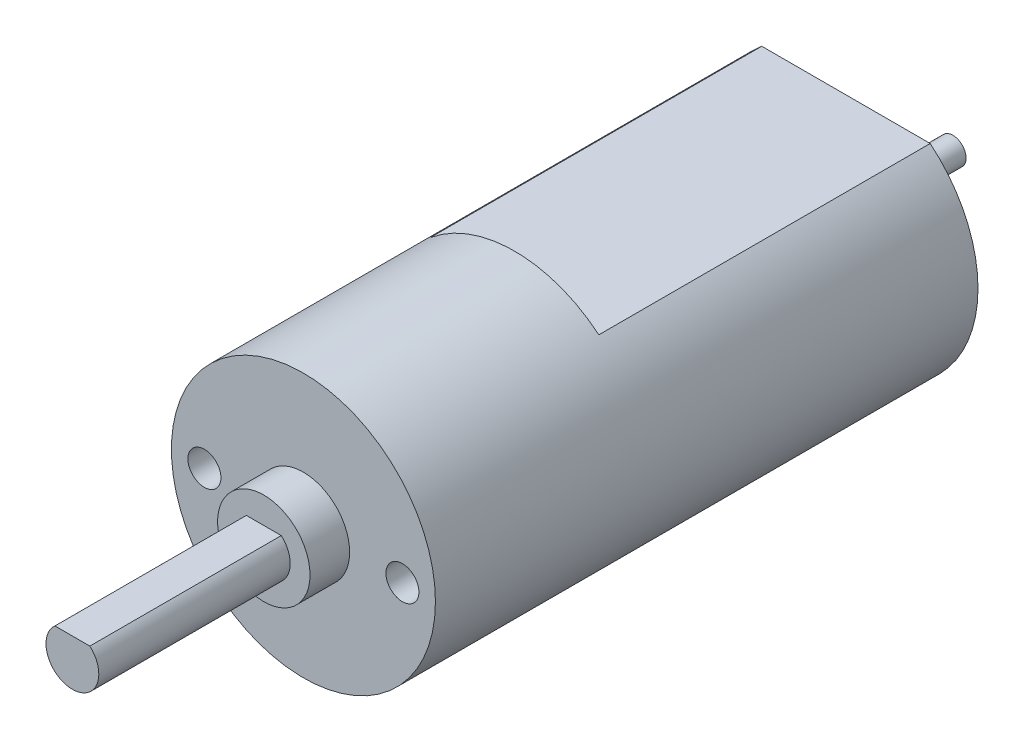
ISO-10303-21;
HEADER;
FILE_DESCRIPTION(('STEP AP214'),'2;1');
FILE_NAME('part.step','',(''),(''),'','','');
FILE_SCHEMA(('AUTOMOTIVE_DESIGN { 1 0 10303 214 1 1 1 1 }'));
ENDSEC;
DATA;
#1=APPLICATION_CONTEXT('core data for automotive mechanical design processes');
#2=APPLICATION_PROTOCOL_DEFINITION('international standard','automotive_design',2000,#1);
#3=PRODUCT_CONTEXT('',#1,'mechanical');
#4=PRODUCT('Part','Part','',(#3));
#5=PRODUCT_RELATED_PRODUCT_CATEGORY('part','',(#4));
#6=PRODUCT_DEFINITION_FORMATION('','',#4);
#7=PRODUCT_DEFINITION_CONTEXT('part definition',#1,'design');
#8=PRODUCT_DEFINITION('design','',#6,#7);
#9=PRODUCT_DEFINITION_SHAPE('','',#8);
#10=(LENGTH_UNIT() NAMED_UNIT(*) SI_UNIT(.MILLI.,.METRE.));
#11=(NAMED_UNIT(*) PLANE_ANGLE_UNIT() SI_UNIT($,.RADIAN.));
#12=(NAMED_UNIT(*) SI_UNIT($,.STERADIAN.) SOLID_ANGLE_UNIT());
#13=UNCERTAINTY_MEASURE_WITH_UNIT(LENGTH_MEASURE(1.E-05),#10,'distance_accuracy_value','');
#14=(GEOMETRIC_REPRESENTATION_CONTEXT(3) GLOBAL_UNCERTAINTY_ASSIGNED_CONTEXT((#13)) GLOBAL_UNIT_ASSIGNED_CONTEXT((#10,
#11,#12)) REPRESENTATION_CONTEXT('',''));
#15=CARTESIAN_POINT('',(0.,0.,0.));
#16=DIRECTION('',(0.,0.,1.));
#17=DIRECTION('',(1.,0.,0.));
#18=AXIS2_PLACEMENT_3D('',#15,#16,#17);
#19=CARTESIAN_POINT('',(0.,0.,-41.1));
#20=DIRECTION('',(0.,0.,1.));
#21=DIRECTION('',(1.,0.,0.));
#22=AXIS2_PLACEMENT_3D('',#19,#20,#21);
#23=CYLINDRICAL_SURFACE('',#22,10.);
#24=CARTESIAN_POINT('',(0.,0.,0.));
#25=DIRECTION('',(0.,0.,1.));
#26=DIRECTION('',(1.,0.,0.));
#27=AXIS2_PLACEMENT_3D('',#24,#25,#26);
#28=CIRCLE('',#27,10.);
#29=CARTESIAN_POINT('',(10.,0.,0.));
#30=VERTEX_POINT('',#29);
#31=EDGE_CURVE('E128',#30,#30,#28,.T.);
#32=ORIENTED_EDGE('',*,*,#31,.F.);
#33=EDGE_LOOP('',(#32));
#34=FACE_BOUND('',#33,.T.);
#35=DIRECTION('',(0.,0.,1.));
#36=VECTOR('',#35,1.);
#37=CARTESIAN_POINT('',(-6.38043885637971,-7.7,-41.1));
#38=LINE('',#37,#36);
#39=CARTESIAN_POINT('',(-6.38043885637971,-7.7,-41.1));
#40=VERTEX_POINT('',#39);
#41=CARTESIAN_POINT('',(-6.38043885637971,-7.7,-16.));
#42=VERTEX_POINT('',#41);
#43=EDGE_CURVE('E56',#40,#42,#38,.T.);
#44=ORIENTED_EDGE('',*,*,#43,.T.);
#45=CARTESIAN_POINT('',(0.,0.,-16.));
#46=DIRECTION('',(0.,0.,-1.));
#47=DIRECTION('',(0.,1.,0.));
#48=AXIS2_PLACEMENT_3D('',#45,#46,#47);
#49=CIRCLE('',#48,10.);
#50=CARTESIAN_POINT('',(6.38043885637971,-7.7,-16.));
#51=VERTEX_POINT('',#50);
#52=EDGE_CURVE('E106',#42,#51,#49,.F.);
#53=ORIENTED_EDGE('',*,*,#52,.T.);
#54=DIRECTION('',(0.,0.,1.));
#55=VECTOR('',#54,1.);
#56=CARTESIAN_POINT('',(6.38043885637971,-7.7,-41.1));
#57=LINE('',#56,#55);
#58=CARTESIAN_POINT('',(6.38043885637971,-7.7,-41.1));
#59=VERTEX_POINT('',#58);
#60=EDGE_CURVE('E117',#51,#59,#57,.F.);
#61=ORIENTED_EDGE('',*,*,#60,.T.);
#62=CARTESIAN_POINT('',(0.,0.,-41.1));
#63=DIRECTION('',(0.,0.,1.));
#64=DIRECTION('',(1.,0.,0.));
#65=AXIS2_PLACEMENT_3D('',#62,#63,#64);
#66=CIRCLE('',#65,10.);
#67=CARTESIAN_POINT('',(6.38043885637971,7.7,-41.1));
#68=VERTEX_POINT('',#67);
#69=EDGE_CURVE('E133',#59,#68,#66,.T.);
#70=ORIENTED_EDGE('',*,*,#69,.T.);
#71=DIRECTION('',(0.,0.,1.));
#72=VECTOR('',#71,1.);
#73=CARTESIAN_POINT('',(6.38043885637971,7.7,-41.1));
#74=LINE('',#73,#72);
#75=CARTESIAN_POINT('',(6.38043885637971,7.7,-16.));
#76=VERTEX_POINT('',#75);
#77=EDGE_CURVE('E125',#76,#68,#74,.F.);
#78=ORIENTED_EDGE('',*,*,#77,.F.);
#79=CARTESIAN_POINT('',(0.,0.,-16.));
#80=DIRECTION('',(0.,0.,1.));
#81=DIRECTION('',(0.,-1.,0.));
#82=AXIS2_PLACEMENT_3D('',#79,#80,#81);
#83=CIRCLE('',#82,10.);
#84=CARTESIAN_POINT('',(-6.38043885637971,7.7,-16.));
#85=VERTEX_POINT('',#84);
#86=EDGE_CURVE('E138',#85,#76,#83,.F.);
#87=ORIENTED_EDGE('',*,*,#86,.F.);
#88=DIRECTION('',(0.,0.,1.));
#89=VECTOR('',#88,1.);
#90=CARTESIAN_POINT('',(-6.38043885637971,7.7,-41.1));
#91=LINE('',#90,#89);
#92=CARTESIAN_POINT('',(-6.38043885637971,7.7,-41.1));
#93=VERTEX_POINT('',#92);
#94=EDGE_CURVE('E123',#93,#85,#91,.T.);
#95=ORIENTED_EDGE('',*,*,#94,.F.);
#96=EDGE_CURVE('E129',#93,#40,#66,.T.);
#97=ORIENTED_EDGE('',*,*,#96,.T.);
#98=EDGE_LOOP('',(#44,#53,#61,#70,#78,#87,#95,#97));
#99=FACE_BOUND('',#98,.T.);
#100=ADVANCED_FACE('F32',(#34,#99),#23,.T.);
#101=CARTESIAN_POINT('',(0.,0.,-41.1));
#102=DIRECTION('',(0.,0.,1.));
#103=DIRECTION('',(1.,0.,0.));
#104=AXIS2_PLACEMENT_3D('',#101,#102,#103);
#105=PLANE('',#104);
#106=CARTESIAN_POINT('',(0.,0.,-41.1));
#107=DIRECTION('',(0.,0.,-1.));
#108=DIRECTION('',(-1.,0.,0.));
#109=AXIS2_PLACEMENT_3D('',#106,#107,#108);
#110=CIRCLE('',#109,3.1);
#111=CARTESIAN_POINT('',(-3.1,0.,-41.1));
#112=VERTEX_POINT('',#111);
#113=EDGE_CURVE('E40',#112,#112,#110,.T.);
#114=ORIENTED_EDGE('',*,*,#113,.F.);
#115=EDGE_LOOP('',(#114));
#116=FACE_BOUND('',#115,.T.);
#117=DIRECTION('',(1.,0.,0.));
#118=VECTOR('',#117,1.);
#119=CARTESIAN_POINT('',(0.,-7.7,-41.1));
#120=LINE('',#119,#118);
#121=EDGE_CURVE('E140',#40,#59,#120,.T.);
#122=ORIENTED_EDGE('',*,*,#121,.F.);
#123=ORIENTED_EDGE('',*,*,#96,.F.);
#124=DIRECTION('',(1.,0.,0.));
#125=VECTOR('',#124,1.);
#126=CARTESIAN_POINT('',(0.,7.7,-41.1));
#127=LINE('',#126,#125);
#128=EDGE_CURVE('E132',#93,#68,#127,.T.);
#129=ORIENTED_EDGE('',*,*,#128,.T.);
#130=ORIENTED_EDGE('',*,*,#69,.F.);
#131=EDGE_LOOP('',(#122,#123,#129,#130));
#132=FACE_BOUND('',#131,.T.);
#133=ADVANCED_FACE('F149',(#116,#132),#105,.F.);
#134=CARTESIAN_POINT('',(0.,0.,0.));
#135=DIRECTION('',(0.,0.,1.));
#136=DIRECTION('',(1.,0.,0.));
#137=AXIS2_PLACEMENT_3D('',#134,#135,#136);
#138=PLANE('',#137);
#139=CARTESIAN_POINT('',(7.5,0.,0.));
#140=DIRECTION('',(0.,0.,-1.));
#141=DIRECTION('',(-1.,0.,0.));
#142=AXIS2_PLACEMENT_3D('',#139,#140,#141);
#143=CIRCLE('',#142,1.25);
#144=CARTESIAN_POINT('',(6.25,0.,0.));
#145=VERTEX_POINT('',#144);
#146=EDGE_CURVE('E336',#145,#145,#143,.T.);
#147=ORIENTED_EDGE('',*,*,#146,.T.);
#148=EDGE_LOOP('',(#147));
#149=FACE_BOUND('',#148,.T.);
#150=CARTESIAN_POINT('',(-7.5,0.,0.));
#151=DIRECTION('',(0.,0.,1.));
#152=DIRECTION('',(1.,0.,0.));
#153=AXIS2_PLACEMENT_3D('',#150,#151,#152);
#154=CIRCLE('',#153,1.25);
#155=CARTESIAN_POINT('',(-6.25,0.,0.));
#156=VERTEX_POINT('',#155);
#157=EDGE_CURVE('E335',#156,#156,#154,.T.);
#158=ORIENTED_EDGE('',*,*,#157,.F.);
#159=EDGE_LOOP('',(#158));
#160=FACE_BOUND('',#159,.T.);
#161=CARTESIAN_POINT('',(0.,0.,0.));
#162=DIRECTION('',(0.,0.,1.));
#163=DIRECTION('',(1.,0.,0.));
#164=AXIS2_PLACEMENT_3D('',#161,#162,#163);
#165=CIRCLE('',#164,3.5);
#166=CARTESIAN_POINT('',(3.5,0.,0.));
#167=VERTEX_POINT('',#166);
#168=EDGE_CURVE('E103',#167,#167,#165,.T.);
#169=ORIENTED_EDGE('',*,*,#168,.F.);
#170=EDGE_LOOP('',(#169));
#171=FACE_BOUND('',#170,.T.);
#172=ORIENTED_EDGE('',*,*,#31,.T.);
#173=EDGE_LOOP('',(#172));
#174=FACE_BOUND('',#173,.T.);
#175=ADVANCED_FACE('F159',(#149,#160,#171,#174),#138,.T.);
#176=CARTESIAN_POINT('',(-10.,10.,-16.));
#177=DIRECTION('',(0.,0.,1.));
#178=DIRECTION('',(0.,-1.,0.));
#179=AXIS2_PLACEMENT_3D('',#176,#177,#178);
#180=PLANE('',#179);
#181=ORIENTED_EDGE('',*,*,#86,.T.);
#182=DIRECTION('',(1.,0.,0.));
#183=VECTOR('',#182,1.);
#184=CARTESIAN_POINT('',(-10.,7.7,-16.));
#185=LINE('',#184,#183);
#186=EDGE_CURVE('E120',#85,#76,#185,.T.);
#187=ORIENTED_EDGE('',*,*,#186,.F.);
#188=EDGE_LOOP('',(#181,#187));
#189=FACE_BOUND('',#188,.T.);
#190=ADVANCED_FACE('F157',(#189),#180,.F.);
#191=CARTESIAN_POINT('',(-10.,7.7,-16.));
#192=DIRECTION('',(0.,-1.,0.));
#193=DIRECTION('',(0.,0.,-1.));
#194=AXIS2_PLACEMENT_3D('',#191,#192,#193);
#195=PLANE('',#194);
#196=ORIENTED_EDGE('',*,*,#77,.T.);
#197=ORIENTED_EDGE('',*,*,#128,.F.);
#198=ORIENTED_EDGE('',*,*,#94,.T.);
#199=ORIENTED_EDGE('',*,*,#186,.T.);
#200=EDGE_LOOP('',(#196,#197,#198,#199));
#201=FACE_BOUND('',#200,.T.);
#202=ADVANCED_FACE('F155',(#201),#195,.F.);
#203=CARTESIAN_POINT('',(-10.,-10.,-16.));
#204=DIRECTION('',(0.,0.,-1.));
#205=DIRECTION('',(0.,1.,0.));
#206=AXIS2_PLACEMENT_3D('',#203,#204,#205);
#207=PLANE('',#206);
#208=DIRECTION('',(1.,0.,0.));
#209=VECTOR('',#208,1.);
#210=CARTESIAN_POINT('',(-10.,-7.7,-16.));
#211=LINE('',#210,#209);
#212=EDGE_CURVE('E112',#42,#51,#211,.T.);
#213=ORIENTED_EDGE('',*,*,#212,.T.);
#214=ORIENTED_EDGE('',*,*,#52,.F.);
#215=EDGE_LOOP('',(#213,#214));
#216=FACE_BOUND('',#215,.T.);
#217=ADVANCED_FACE('F145',(#216),#207,.T.);
#218=CARTESIAN_POINT('',(-10.,-7.7,-16.));
#219=DIRECTION('',(0.,-1.,0.));
#220=DIRECTION('',(0.,0.,-1.));
#221=AXIS2_PLACEMENT_3D('',#218,#219,#220);
#222=PLANE('',#221);
#223=ORIENTED_EDGE('',*,*,#212,.F.);
#224=ORIENTED_EDGE('',*,*,#43,.F.);
#225=ORIENTED_EDGE('',*,*,#121,.T.);
#226=ORIENTED_EDGE('',*,*,#60,.F.);
#227=EDGE_LOOP('',(#223,#224,#225,#226));
#228=FACE_BOUND('',#227,.T.);
#229=ADVANCED_FACE('F146',(#228),#222,.T.);
#230=CARTESIAN_POINT('',(0.,0.,3.));
#231=DIRECTION('',(0.,0.,-1.));
#232=DIRECTION('',(-1.,0.,0.));
#233=AXIS2_PLACEMENT_3D('',#230,#231,#232);
#234=CYLINDRICAL_SURFACE('',#233,3.5);
#235=CARTESIAN_POINT('',(0.,0.,3.));
#236=DIRECTION('',(0.,0.,1.));
#237=DIRECTION('',(1.,0.,0.));
#238=AXIS2_PLACEMENT_3D('',#235,#236,#237);
#239=CIRCLE('',#238,3.5);
#240=CARTESIAN_POINT('',(3.5,0.,3.));
#241=VERTEX_POINT('',#240);
#242=EDGE_CURVE('E110',#241,#241,#239,.T.);
#243=ORIENTED_EDGE('',*,*,#242,.F.);
#244=EDGE_LOOP('',(#243));
#245=FACE_BOUND('',#244,.T.);
#246=ORIENTED_EDGE('',*,*,#168,.T.);
#247=EDGE_LOOP('',(#246));
#248=FACE_BOUND('',#247,.T.);
#249=ADVANCED_FACE('F199',(#245,#248),#234,.T.);
#250=CARTESIAN_POINT('',(0.,0.,3.));
#251=DIRECTION('',(0.,0.,1.));
#252=DIRECTION('',(1.,0.,0.));
#253=AXIS2_PLACEMENT_3D('',#250,#251,#252);
#254=PLANE('',#253);
#255=CARTESIAN_POINT('',(0.,0.,3.));
#256=DIRECTION('',(0.,0.,1.));
#257=DIRECTION('',(1.,0.,0.));
#258=AXIS2_PLACEMENT_3D('',#255,#256,#257);
#259=CIRCLE('',#258,2.);
#260=CARTESIAN_POINT('',(-1.32287565553229,1.5,3.));
#261=VERTEX_POINT('',#260);
#262=CARTESIAN_POINT('',(1.32287565553229,1.5,3.));
#263=VERTEX_POINT('',#262);
#264=EDGE_CURVE('E97',#261,#263,#259,.T.);
#265=ORIENTED_EDGE('',*,*,#264,.F.);
#266=DIRECTION('',(1.,0.,0.));
#267=VECTOR('',#266,1.);
#268=CARTESIAN_POINT('',(-10.,1.5,3.));
#269=LINE('',#268,#267);
#270=EDGE_CURVE('E85',#261,#263,#269,.T.);
#271=ORIENTED_EDGE('',*,*,#270,.T.);
#272=EDGE_LOOP('',(#265,#271));
#273=FACE_BOUND('',#272,.T.);
#274=ORIENTED_EDGE('',*,*,#242,.T.);
#275=EDGE_LOOP('',(#274));
#276=FACE_BOUND('',#275,.T.);
#277=ADVANCED_FACE('F101',(#273,#276),#254,.T.);
#278=CARTESIAN_POINT('',(0.,0.,17.5));
#279=DIRECTION('',(0.,0.,-1.));
#280=DIRECTION('',(-1.,0.,0.));
#281=AXIS2_PLACEMENT_3D('',#278,#279,#280);
#282=CYLINDRICAL_SURFACE('',#281,2.);
#283=CARTESIAN_POINT('',(0.,0.,17.5));
#284=DIRECTION('',(0.,0.,1.));
#285=DIRECTION('',(1.,0.,0.));
#286=AXIS2_PLACEMENT_3D('',#283,#284,#285);
#287=CIRCLE('',#286,2.);
#288=CARTESIAN_POINT('',(-1.3228756555323,1.5,17.5));
#289=VERTEX_POINT('',#288);
#290=CARTESIAN_POINT('',(1.32287565553229,1.5,17.5));
#291=VERTEX_POINT('',#290);
#292=EDGE_CURVE('E99',#289,#291,#287,.T.);
#293=ORIENTED_EDGE('',*,*,#292,.F.);
#294=DIRECTION('',(0.,0.,-1.));
#295=VECTOR('',#294,1.);
#296=CARTESIAN_POINT('',(-1.32287565553229,1.5,17.5));
#297=LINE('',#296,#295);
#298=EDGE_CURVE('E48',#289,#261,#297,.T.);
#299=ORIENTED_EDGE('',*,*,#298,.T.);
#300=ORIENTED_EDGE('',*,*,#264,.T.);
#301=DIRECTION('',(0.,0.,-1.));
#302=VECTOR('',#301,1.);
#303=CARTESIAN_POINT('',(1.32287565553229,1.5,17.5));
#304=LINE('',#303,#302);
#305=EDGE_CURVE('E88',#263,#291,#304,.F.);
#306=ORIENTED_EDGE('',*,*,#305,.T.);
#307=EDGE_LOOP('',(#293,#299,#300,#306));
#308=FACE_BOUND('',#307,.T.);
#309=ADVANCED_FACE('F96',(#308),#282,.T.);
#310=CARTESIAN_POINT('',(0.,0.,17.5));
#311=DIRECTION('',(0.,0.,1.));
#312=DIRECTION('',(1.,0.,0.));
#313=AXIS2_PLACEMENT_3D('',#310,#311,#312);
#314=PLANE('',#313);
#315=DIRECTION('',(1.,0.,0.));
#316=VECTOR('',#315,1.);
#317=CARTESIAN_POINT('',(0.,1.5,17.5));
#318=LINE('',#317,#316);
#319=EDGE_CURVE('E35',#289,#291,#318,.T.);
#320=ORIENTED_EDGE('',*,*,#319,.F.);
#321=ORIENTED_EDGE('',*,*,#292,.T.);
#322=EDGE_LOOP('',(#320,#321));
#323=FACE_BOUND('',#322,.T.);
#324=ADVANCED_FACE('F185',(#323),#314,.T.);
#325=CARTESIAN_POINT('',(-10.,1.5,17.5));
#326=DIRECTION('',(0.,-1.,0.));
#327=DIRECTION('',(0.,0.,-1.));
#328=AXIS2_PLACEMENT_3D('',#325,#326,#327);
#329=PLANE('',#328);
#330=ORIENTED_EDGE('',*,*,#319,.T.);
#331=ORIENTED_EDGE('',*,*,#305,.F.);
#332=ORIENTED_EDGE('',*,*,#270,.F.);
#333=ORIENTED_EDGE('',*,*,#298,.F.);
#334=EDGE_LOOP('',(#330,#331,#332,#333));
#335=FACE_BOUND('',#334,.T.);
#336=ADVANCED_FACE('F86',(#335),#329,.F.);
#337=CARTESIAN_POINT('',(0.,0.,-43.2));
#338=DIRECTION('',(0.,0.,1.));
#339=DIRECTION('',(1.,0.,0.));
#340=AXIS2_PLACEMENT_3D('',#337,#338,#339);
#341=CYLINDRICAL_SURFACE('',#340,3.1);
#342=CARTESIAN_POINT('',(0.,0.,-43.2));
#343=DIRECTION('',(0.,0.,-1.));
#344=DIRECTION('',(-1.,0.,0.));
#345=AXIS2_PLACEMENT_3D('',#342,#343,#344);
#346=CIRCLE('',#345,3.1);
#347=CARTESIAN_POINT('',(-3.1,0.,-43.2));
#348=VERTEX_POINT('',#347);
#349=EDGE_CURVE('E92',#348,#348,#346,.T.);
#350=ORIENTED_EDGE('',*,*,#349,.F.);
#351=EDGE_LOOP('',(#350));
#352=FACE_BOUND('',#351,.T.);
#353=ORIENTED_EDGE('',*,*,#113,.T.);
#354=EDGE_LOOP('',(#353));
#355=FACE_BOUND('',#354,.T.);
#356=ADVANCED_FACE('F192',(#352,#355),#341,.T.);
#357=CARTESIAN_POINT('',(0.,0.,-43.2));
#358=DIRECTION('',(0.,0.,-1.));
#359=DIRECTION('',(-1.,0.,0.));
#360=AXIS2_PLACEMENT_3D('',#357,#358,#359);
#361=PLANE('',#360);
#362=CARTESIAN_POINT('',(0.,0.,-43.2));
#363=DIRECTION('',(0.,0.,-1.));
#364=DIRECTION('',(-1.,0.,0.));
#365=AXIS2_PLACEMENT_3D('',#362,#363,#364);
#366=CIRCLE('',#365,1.);
#367=CARTESIAN_POINT('',(-1.,0.,-43.2));
#368=VERTEX_POINT('',#367);
#369=EDGE_CURVE('E11',#368,#368,#366,.T.);
#370=ORIENTED_EDGE('',*,*,#369,.F.);
#371=EDGE_LOOP('',(#370));
#372=FACE_BOUND('',#371,.T.);
#373=ORIENTED_EDGE('',*,*,#349,.T.);
#374=EDGE_LOOP('',(#373));
#375=FACE_BOUND('',#374,.T.);
#376=ADVANCED_FACE('F252',(#372,#375),#361,.T.);
#377=CARTESIAN_POINT('',(0.,0.,-49.2));
#378=DIRECTION('',(0.,0.,1.));
#379=DIRECTION('',(1.,0.,0.));
#380=AXIS2_PLACEMENT_3D('',#377,#378,#379);
#381=CYLINDRICAL_SURFACE('',#380,1.);
#382=CARTESIAN_POINT('',(0.,0.,-49.2));
#383=DIRECTION('',(0.,0.,-1.));
#384=DIRECTION('',(-1.,0.,0.));
#385=AXIS2_PLACEMENT_3D('',#382,#383,#384);
#386=CIRCLE('',#385,1.);
#387=CARTESIAN_POINT('',(-1.,0.,-49.2));
#388=VERTEX_POINT('',#387);
#389=EDGE_CURVE('E345',#388,#388,#386,.T.);
#390=ORIENTED_EDGE('',*,*,#389,.F.);
#391=EDGE_LOOP('',(#390));
#392=FACE_BOUND('',#391,.T.);
#393=ORIENTED_EDGE('',*,*,#369,.T.);
#394=EDGE_LOOP('',(#393));
#395=FACE_BOUND('',#394,.T.);
#396=ADVANCED_FACE('F261',(#392,#395),#381,.T.);
#397=CARTESIAN_POINT('',(0.,0.,-49.2));
#398=DIRECTION('',(0.,0.,-1.));
#399=DIRECTION('',(-1.,0.,0.));
#400=AXIS2_PLACEMENT_3D('',#397,#398,#399);
#401=PLANE('',#400);
#402=ORIENTED_EDGE('',*,*,#389,.T.);
#403=EDGE_LOOP('',(#402));
#404=FACE_BOUND('',#403,.T.);
#405=ADVANCED_FACE('F271',(#404),#401,.T.);
#406=CARTESIAN_POINT('',(-7.5,0.,-15.));
#407=DIRECTION('',(0.,0.,1.));
#408=DIRECTION('',(1.,0.,0.));
#409=AXIS2_PLACEMENT_3D('',#406,#407,#408);
#410=CYLINDRICAL_SURFACE('',#409,1.25);
#411=CARTESIAN_POINT('',(-7.5,0.,-15.));
#412=DIRECTION('',(0.,0.,1.));
#413=DIRECTION('',(1.,0.,0.));
#414=AXIS2_PLACEMENT_3D('',#411,#412,#413);
#415=CIRCLE('',#414,1.25);
#416=CARTESIAN_POINT('',(-6.25,0.,-15.));
#417=VERTEX_POINT('',#416);
#418=EDGE_CURVE('E339',#417,#417,#415,.T.);
#419=ORIENTED_EDGE('',*,*,#418,.F.);
#420=EDGE_LOOP('',(#419));
#421=FACE_BOUND('',#420,.T.);
#422=ORIENTED_EDGE('',*,*,#157,.T.);
#423=EDGE_LOOP('',(#422));
#424=FACE_BOUND('',#423,.T.);
#425=ADVANCED_FACE('F281',(#421,#424),#410,.F.);
#426=CARTESIAN_POINT('',(-7.5,0.,-15.));
#427=DIRECTION('',(0.,0.,1.));
#428=DIRECTION('',(1.,0.,0.));
#429=AXIS2_PLACEMENT_3D('',#426,#427,#428);
#430=PLANE('',#429);
#431=ORIENTED_EDGE('',*,*,#418,.T.);
#432=EDGE_LOOP('',(#431));
#433=FACE_BOUND('',#432,.T.);
#434=ADVANCED_FACE('F291',(#433),#430,.T.);
#435=CARTESIAN_POINT('',(7.5,0.,-15.));
#436=DIRECTION('',(0.,0.,1.));
#437=DIRECTION('',(1.,0.,0.));
#438=AXIS2_PLACEMENT_3D('',#435,#436,#437);
#439=CYLINDRICAL_SURFACE('',#438,1.25);
#440=CARTESIAN_POINT('',(7.5,0.,-15.));
#441=DIRECTION('',(0.,0.,-1.));
#442=DIRECTION('',(-1.,0.,0.));
#443=AXIS2_PLACEMENT_3D('',#440,#441,#442);
#444=CIRCLE('',#443,1.25);
#445=CARTESIAN_POINT('',(6.25,0.,-15.));
#446=VERTEX_POINT('',#445);
#447=EDGE_CURVE('E334',#446,#446,#444,.T.);
#448=ORIENTED_EDGE('',*,*,#447,.T.);
#449=EDGE_LOOP('',(#448));
#450=FACE_BOUND('',#449,.T.);
#451=ORIENTED_EDGE('',*,*,#146,.F.);
#452=EDGE_LOOP('',(#451));
#453=FACE_BOUND('',#452,.T.);
#454=ADVANCED_FACE('F301',(#450,#453),#439,.F.);
#455=CARTESIAN_POINT('',(7.5,0.,-15.));
#456=DIRECTION('',(0.,0.,1.));
#457=DIRECTION('',(-1.,0.,0.));
#458=AXIS2_PLACEMENT_3D('',#455,#456,#457);
#459=PLANE('',#458);
#460=ORIENTED_EDGE('',*,*,#447,.F.);
#461=EDGE_LOOP('',(#460));
#462=FACE_BOUND('',#461,.T.);
#463=ADVANCED_FACE('F318',(#462),#459,.T.);
#464=CLOSED_SHELL('',(#100,#133,#175,#190,#202,#217,#229,#249,#277,#309,#324,#336,#356,#376,
#396,#405,#425,#434,#454,#463));
#465=MANIFOLD_SOLID_BREP('B2',#464);
#466=ADVANCED_BREP_SHAPE_REPRESENTATION('',(#18,#465),#14);
#467=SHAPE_DEFINITION_REPRESENTATION(#9,#466);
ENDSEC;
END-ISO-10303-21;
